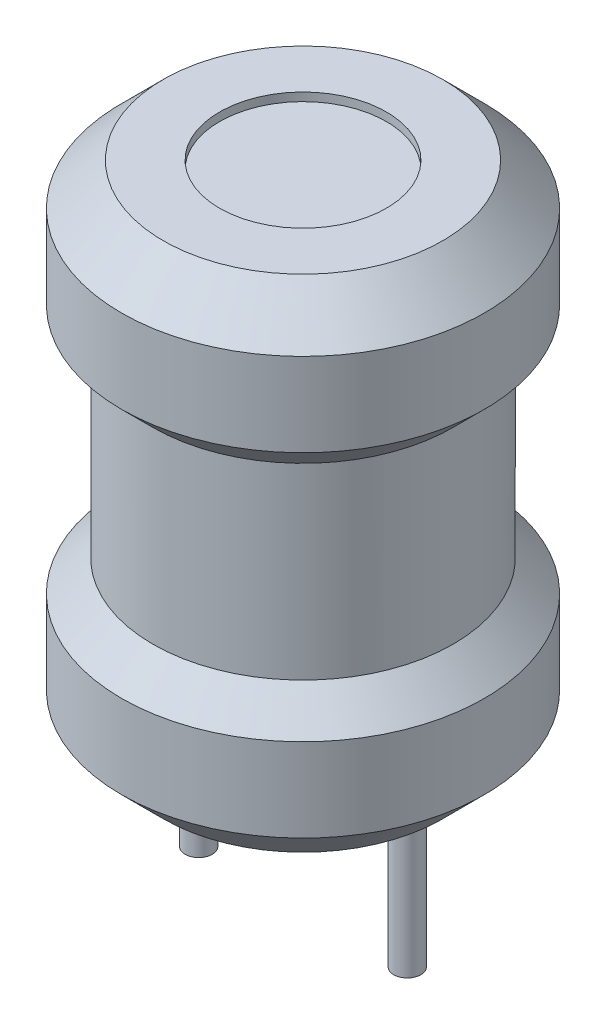
ISO-10303-21;
HEADER;
FILE_DESCRIPTION(('STEP AP214'),'2;1');
FILE_NAME('part.step','',(''),(''),'','','');
FILE_SCHEMA(('AUTOMOTIVE_DESIGN { 1 0 10303 214 1 1 1 1 }'));
ENDSEC;
DATA;
#1=APPLICATION_CONTEXT('core data for automotive mechanical design processes');
#2=APPLICATION_PROTOCOL_DEFINITION('international standard','automotive_design',2000,#1);
#3=PRODUCT_CONTEXT('',#1,'mechanical');
#4=PRODUCT('Part','Part','',(#3));
#5=PRODUCT_RELATED_PRODUCT_CATEGORY('part','',(#4));
#6=PRODUCT_DEFINITION_FORMATION('','',#4);
#7=PRODUCT_DEFINITION_CONTEXT('part definition',#1,'design');
#8=PRODUCT_DEFINITION('design','',#6,#7);
#9=PRODUCT_DEFINITION_SHAPE('','',#8);
#10=(LENGTH_UNIT() NAMED_UNIT(*) SI_UNIT(.MILLI.,.METRE.));
#11=(NAMED_UNIT(*) PLANE_ANGLE_UNIT() SI_UNIT($,.RADIAN.));
#12=(NAMED_UNIT(*) SI_UNIT($,.STERADIAN.) SOLID_ANGLE_UNIT());
#13=UNCERTAINTY_MEASURE_WITH_UNIT(LENGTH_MEASURE(1.E-05),#10,'distance_accuracy_value','');
#14=(GEOMETRIC_REPRESENTATION_CONTEXT(3) GLOBAL_UNCERTAINTY_ASSIGNED_CONTEXT((#13)) GLOBAL_UNIT_ASSIGNED_CONTEXT((#10,
#11,#12)) REPRESENTATION_CONTEXT('',''));
#15=CARTESIAN_POINT('',(0.,0.,0.));
#16=DIRECTION('',(0.,0.,1.));
#17=DIRECTION('',(1.,0.,0.));
#18=AXIS2_PLACEMENT_3D('',#15,#16,#17);
#19=CARTESIAN_POINT('',(-2.5,-3.5,0.));
#20=DIRECTION('',(0.,-1.,0.));
#21=DIRECTION('',(0.,0.,-1.));
#22=AXIS2_PLACEMENT_3D('',#19,#20,#21);
#23=PLANE('',#22);
#24=CARTESIAN_POINT('',(-2.5,-3.5,0.));
#25=DIRECTION('',(0.,1.,0.));
#26=DIRECTION('',(0.,0.,1.));
#27=AXIS2_PLACEMENT_3D('',#24,#25,#26);
#28=CIRCLE('',#27,0.325);
#29=CARTESIAN_POINT('',(-2.5,-3.5,0.325));
#30=VERTEX_POINT('',#29);
#31=EDGE_CURVE('E18',#30,#30,#28,.T.);
#32=ORIENTED_EDGE('',*,*,#31,.F.);
#33=EDGE_LOOP('',(#32));
#34=FACE_BOUND('',#33,.T.);
#35=ADVANCED_FACE('F15',(#34),#23,.T.);
#36=CARTESIAN_POINT('',(2.5,-3.5,0.));
#37=DIRECTION('',(0.,-1.,0.));
#38=DIRECTION('',(0.,0.,-1.));
#39=AXIS2_PLACEMENT_3D('',#36,#37,#38);
#40=PLANE('',#39);
#41=CARTESIAN_POINT('',(2.5,-3.5,0.));
#42=DIRECTION('',(0.,1.,0.));
#43=DIRECTION('',(0.,0.,1.));
#44=AXIS2_PLACEMENT_3D('',#41,#42,#43);
#45=CIRCLE('',#44,0.325);
#46=CARTESIAN_POINT('',(2.5,-3.5,0.325));
#47=VERTEX_POINT('',#46);
#48=EDGE_CURVE('E58',#47,#47,#45,.T.);
#49=ORIENTED_EDGE('',*,*,#48,.F.);
#50=EDGE_LOOP('',(#49));
#51=FACE_BOUND('',#50,.T.);
#52=ADVANCED_FACE('F69',(#51),#40,.T.);
#53=CARTESIAN_POINT('',(0.,11.8,0.));
#54=DIRECTION('',(0.,1.,0.));
#55=DIRECTION('',(0.,0.,1.));
#56=AXIS2_PLACEMENT_3D('',#53,#54,#55);
#57=PLANE('',#56);
#58=CARTESIAN_POINT('',(0.,11.8,0.));
#59=DIRECTION('',(0.,1.,0.));
#60=DIRECTION('',(0.,0.,1.));
#61=AXIS2_PLACEMENT_3D('',#58,#59,#60);
#62=CIRCLE('',#61,2.);
#63=CARTESIAN_POINT('',(0.,11.8,2.));
#64=VERTEX_POINT('',#63);
#65=EDGE_CURVE('E56',#64,#64,#62,.T.);
#66=ORIENTED_EDGE('',*,*,#65,.T.);
#67=EDGE_LOOP('',(#66));
#68=FACE_BOUND('',#67,.T.);
#69=ADVANCED_FACE('F74',(#68),#57,.T.);
#70=CARTESIAN_POINT('',(-2.5,-3.5,0.));
#71=DIRECTION('',(0.,1.,0.));
#72=DIRECTION('',(0.,0.,1.));
#73=AXIS2_PLACEMENT_3D('',#70,#71,#72);
#74=CYLINDRICAL_SURFACE('',#73,0.325);
#75=ORIENTED_EDGE('',*,*,#31,.T.);
#76=EDGE_LOOP('',(#75));
#77=FACE_BOUND('',#76,.T.);
#78=CARTESIAN_POINT('',(-2.5,0.,0.));
#79=DIRECTION('',(0.,1.,0.));
#80=DIRECTION('',(0.,0.,1.));
#81=AXIS2_PLACEMENT_3D('',#78,#79,#80);
#82=CIRCLE('',#81,0.325);
#83=CARTESIAN_POINT('',(-2.5,0.,0.325));
#84=VERTEX_POINT('',#83);
#85=EDGE_CURVE('E53',#84,#84,#82,.F.);
#86=ORIENTED_EDGE('',*,*,#85,.T.);
#87=EDGE_LOOP('',(#86));
#88=FACE_BOUND('',#87,.T.);
#89=ADVANCED_FACE('F65',(#77,#88),#74,.T.);
#90=CARTESIAN_POINT('',(2.5,-3.5,0.));
#91=DIRECTION('',(0.,1.,0.));
#92=DIRECTION('',(0.,0.,1.));
#93=AXIS2_PLACEMENT_3D('',#90,#91,#92);
#94=CYLINDRICAL_SURFACE('',#93,0.325);
#95=ORIENTED_EDGE('',*,*,#48,.T.);
#96=EDGE_LOOP('',(#95));
#97=FACE_BOUND('',#96,.T.);
#98=CARTESIAN_POINT('',(2.5,0.,0.));
#99=DIRECTION('',(0.,1.,0.));
#100=DIRECTION('',(0.,0.,1.));
#101=AXIS2_PLACEMENT_3D('',#98,#99,#100);
#102=CIRCLE('',#101,0.325);
#103=CARTESIAN_POINT('',(2.5,0.,0.325));
#104=VERTEX_POINT('',#103);
#105=EDGE_CURVE('E50',#104,#104,#102,.F.);
#106=ORIENTED_EDGE('',*,*,#105,.T.);
#107=EDGE_LOOP('',(#106));
#108=FACE_BOUND('',#107,.T.);
#109=ADVANCED_FACE('F118',(#97,#108),#94,.T.);
#110=CARTESIAN_POINT('',(0.,11.8,0.));
#111=DIRECTION('',(0.,1.,0.));
#112=DIRECTION('',(0.,0.,1.));
#113=AXIS2_PLACEMENT_3D('',#110,#111,#112);
#114=CYLINDRICAL_SURFACE('',#113,2.);
#115=CARTESIAN_POINT('',(0.,12.,0.));
#116=DIRECTION('',(0.,1.,0.));
#117=DIRECTION('',(0.,0.,1.));
#118=AXIS2_PLACEMENT_3D('',#115,#116,#117);
#119=CIRCLE('',#118,2.);
#120=CARTESIAN_POINT('',(0.,12.,2.));
#121=VERTEX_POINT('',#120);
#122=EDGE_CURVE('E47',#121,#121,#119,.F.);
#123=ORIENTED_EDGE('',*,*,#122,.F.);
#124=EDGE_LOOP('',(#123));
#125=FACE_BOUND('',#124,.T.);
#126=ORIENTED_EDGE('',*,*,#65,.F.);
#127=EDGE_LOOP('',(#126));
#128=FACE_BOUND('',#127,.T.);
#129=ADVANCED_FACE('F114',(#125,#128),#114,.F.);
#130=CARTESIAN_POINT('',(0.,0.,0.));
#131=DIRECTION('',(0.,1.,0.));
#132=DIRECTION('',(0.,0.,1.));
#133=AXIS2_PLACEMENT_3D('',#130,#131,#132);
#134=PLANE('',#133);
#135=ORIENTED_EDGE('',*,*,#105,.F.);
#136=EDGE_LOOP('',(#135));
#137=FACE_BOUND('',#136,.T.);
#138=CARTESIAN_POINT('',(0.,-5.6843418860808E-11,0.));
#139=DIRECTION('',(0.,1.,0.));
#140=DIRECTION('',(0.,0.,1.));
#141=AXIS2_PLACEMENT_3D('',#138,#139,#140);
#142=CIRCLE('',#141,3.35000000001173);
#143=CARTESIAN_POINT('',(0.,-5.6843418860808E-11,3.35000000001173));
#144=VERTEX_POINT('',#143);
#145=EDGE_CURVE('E44',#144,#144,#142,.T.);
#146=ORIENTED_EDGE('',*,*,#145,.F.);
#147=EDGE_LOOP('',(#146));
#148=FACE_BOUND('',#147,.T.);
#149=ORIENTED_EDGE('',*,*,#85,.F.);
#150=EDGE_LOOP('',(#149));
#151=FACE_BOUND('',#150,.T.);
#152=ADVANCED_FACE('F110',(#137,#148,#151),#134,.F.);
#153=CARTESIAN_POINT('',(0.,12.,0.));
#154=DIRECTION('',(0.,1.,0.));
#155=DIRECTION('',(0.,0.,1.));
#156=AXIS2_PLACEMENT_3D('',#153,#154,#155);
#157=PLANE('',#156);
#158=ORIENTED_EDGE('',*,*,#122,.T.);
#159=EDGE_LOOP('',(#158));
#160=FACE_BOUND('',#159,.T.);
#161=CARTESIAN_POINT('',(0.,12.0000000000005,0.));
#162=DIRECTION('',(0.,-1.,0.));
#163=DIRECTION('',(0.,0.,-1.));
#164=AXIS2_PLACEMENT_3D('',#161,#162,#163);
#165=CIRCLE('',#164,3.35000000001173);
#166=CARTESIAN_POINT('',(0.,12.0000000000005,-3.35000000001173));
#167=VERTEX_POINT('',#166);
#168=EDGE_CURVE('E41',#167,#167,#165,.T.);
#169=ORIENTED_EDGE('',*,*,#168,.F.);
#170=EDGE_LOOP('',(#169));
#171=FACE_BOUND('',#170,.T.);
#172=ADVANCED_FACE('F106',(#160,#171),#157,.T.);
#173=CARTESIAN_POINT('',(0.,1.0000000000332,0.));
#174=DIRECTION('',(0.,1.,0.));
#175=DIRECTION('',(0.,0.,1.));
#176=AXIS2_PLACEMENT_3D('',#173,#174,#175);
#177=CONICAL_SURFACE('',#176,4.35000000010177,0.785398163397448);
#178=CARTESIAN_POINT('',(0.,1.,0.));
#179=DIRECTION('',(0.,-1.,0.));
#180=DIRECTION('',(0.,0.,-1.));
#181=AXIS2_PLACEMENT_3D('',#178,#179,#180);
#182=CIRCLE('',#181,4.35);
#183=CARTESIAN_POINT('',(0.,1.,-4.35));
#184=VERTEX_POINT('',#183);
#185=EDGE_CURVE('E38',#184,#184,#182,.F.);
#186=ORIENTED_EDGE('',*,*,#185,.F.);
#187=EDGE_LOOP('',(#186));
#188=FACE_BOUND('',#187,.T.);
#189=ORIENTED_EDGE('',*,*,#145,.T.);
#190=EDGE_LOOP('',(#189));
#191=FACE_BOUND('',#190,.T.);
#192=ADVANCED_FACE('F102',(#188,#191),#177,.T.);
#193=CARTESIAN_POINT('',(0.,10.9999999999673,0.));
#194=DIRECTION('',(0.,-1.,0.));
#195=DIRECTION('',(0.,0.,-1.));
#196=AXIS2_PLACEMENT_3D('',#193,#194,#195);
#197=CONICAL_SURFACE('',#196,4.34999999998809,0.785398163369027);
#198=CARTESIAN_POINT('',(0.,11.,0.));
#199=DIRECTION('',(0.,-1.,0.));
#200=DIRECTION('',(0.,0.,-1.));
#201=AXIS2_PLACEMENT_3D('',#198,#199,#200);
#202=CIRCLE('',#201,4.35);
#203=CARTESIAN_POINT('',(0.,11.,-4.35));
#204=VERTEX_POINT('',#203);
#205=EDGE_CURVE('E35',#204,#204,#202,.T.);
#206=ORIENTED_EDGE('',*,*,#205,.F.);
#207=EDGE_LOOP('',(#206));
#208=FACE_BOUND('',#207,.T.);
#209=ORIENTED_EDGE('',*,*,#168,.T.);
#210=EDGE_LOOP('',(#209));
#211=FACE_BOUND('',#210,.T.);
#212=ADVANCED_FACE('F98',(#208,#211),#197,.T.);
#213=CARTESIAN_POINT('',(0.,12.,0.));
#214=DIRECTION('',(0.,-1.,0.));
#215=DIRECTION('',(0.,0.,-1.));
#216=AXIS2_PLACEMENT_3D('',#213,#214,#215);
#217=CYLINDRICAL_SURFACE('',#216,4.35);
#218=ORIENTED_EDGE('',*,*,#185,.T.);
#219=EDGE_LOOP('',(#218));
#220=FACE_BOUND('',#219,.T.);
#221=CARTESIAN_POINT('',(0.,3.00000000004275,0.));
#222=DIRECTION('',(0.,-1.,0.));
#223=DIRECTION('',(0.,0.,-1.));
#224=AXIS2_PLACEMENT_3D('',#221,#222,#223);
#225=CIRCLE('',#224,4.34999999998809);
#226=CARTESIAN_POINT('',(0.,3.00000000004275,-4.34999999998809));
#227=VERTEX_POINT('',#226);
#228=EDGE_CURVE('E32',#227,#227,#225,.F.);
#229=ORIENTED_EDGE('',*,*,#228,.F.);
#230=EDGE_LOOP('',(#229));
#231=FACE_BOUND('',#230,.T.);
#232=ADVANCED_FACE('F94',(#220,#231),#217,.T.);
#233=CARTESIAN_POINT('',(0.,12.,0.));
#234=DIRECTION('',(0.,-1.,0.));
#235=DIRECTION('',(0.,0.,-1.));
#236=AXIS2_PLACEMENT_3D('',#233,#234,#235);
#237=CYLINDRICAL_SURFACE('',#236,4.35);
#238=CARTESIAN_POINT('',(0.,9.0000000000714,0.));
#239=DIRECTION('',(0.,1.,0.));
#240=DIRECTION('',(0.,0.,1.));
#241=AXIS2_PLACEMENT_3D('',#238,#239,#240);
#242=CIRCLE('',#241,4.34999999998809);
#243=CARTESIAN_POINT('',(0.,9.0000000000714,4.34999999998809));
#244=VERTEX_POINT('',#243);
#245=EDGE_CURVE('E27',#244,#244,#242,.F.);
#246=ORIENTED_EDGE('',*,*,#245,.F.);
#247=EDGE_LOOP('',(#246));
#248=FACE_BOUND('',#247,.T.);
#249=ORIENTED_EDGE('',*,*,#205,.T.);
#250=EDGE_LOOP('',(#249));
#251=FACE_BOUND('',#250,.T.);
#252=ADVANCED_FACE('F90',(#248,#251),#237,.T.);
#253=CARTESIAN_POINT('',(0.,3.00000000009959,0.));
#254=DIRECTION('',(0.,-1.,0.));
#255=DIRECTION('',(0.,0.,-1.));
#256=AXIS2_PLACEMENT_3D('',#253,#254,#255);
#257=CONICAL_SURFACE('',#256,4.3499999998744,0.785398163359553);
#258=ORIENTED_EDGE('',*,*,#228,.T.);
#259=EDGE_LOOP('',(#258));
#260=FACE_BOUND('',#259,.T.);
#261=CARTESIAN_POINT('',(0.,3.75,0.));
#262=DIRECTION('',(0.,1.,0.));
#263=DIRECTION('',(0.,0.,1.));
#264=AXIS2_PLACEMENT_3D('',#261,#262,#263);
#265=CIRCLE('',#264,3.6);
#266=CARTESIAN_POINT('',(0.,3.75,3.6));
#267=VERTEX_POINT('',#266);
#268=EDGE_CURVE('E22',#267,#267,#265,.T.);
#269=ORIENTED_EDGE('',*,*,#268,.F.);
#270=EDGE_LOOP('',(#269));
#271=FACE_BOUND('',#270,.T.);
#272=ADVANCED_FACE('F83',(#260,#271),#257,.T.);
#273=CARTESIAN_POINT('',(0.,9.0000000000714,0.));
#274=DIRECTION('',(0.,1.,0.));
#275=DIRECTION('',(0.,0.,1.));
#276=AXIS2_PLACEMENT_3D('',#273,#274,#275);
#277=CONICAL_SURFACE('',#276,4.34999999998809,0.785398163359553);
#278=ORIENTED_EDGE('',*,*,#245,.T.);
#279=EDGE_LOOP('',(#278));
#280=FACE_BOUND('',#279,.T.);
#281=CARTESIAN_POINT('',(0.,8.25000000000001,0.));
#282=DIRECTION('',(0.,1.,0.));
#283=DIRECTION('',(0.,0.,1.));
#284=AXIS2_PLACEMENT_3D('',#281,#282,#283);
#285=CIRCLE('',#284,3.6);
#286=CARTESIAN_POINT('',(0.,8.25000000000001,3.6));
#287=VERTEX_POINT('',#286);
#288=EDGE_CURVE('E10',#287,#287,#285,.F.);
#289=ORIENTED_EDGE('',*,*,#288,.F.);
#290=EDGE_LOOP('',(#289));
#291=FACE_BOUND('',#290,.T.);
#292=ADVANCED_FACE('F78',(#280,#291),#277,.T.);
#293=CARTESIAN_POINT('',(0.,12.,0.));
#294=DIRECTION('',(0.,1.,0.));
#295=DIRECTION('',(0.,0.,1.));
#296=AXIS2_PLACEMENT_3D('',#293,#294,#295);
#297=CYLINDRICAL_SURFACE('',#296,3.6);
#298=ORIENTED_EDGE('',*,*,#288,.T.);
#299=EDGE_LOOP('',(#298));
#300=FACE_BOUND('',#299,.T.);
#301=ORIENTED_EDGE('',*,*,#268,.T.);
#302=EDGE_LOOP('',(#301));
#303=FACE_BOUND('',#302,.T.);
#304=ADVANCED_FACE('F76',(#300,#303),#297,.T.);
#305=CLOSED_SHELL('',(#35,#52,#69,#89,#109,#129,#152,#172,#192,#212,#232,#252,#272,#292,#304));
#306=MANIFOLD_SOLID_BREP('B1',#305);
#307=ADVANCED_BREP_SHAPE_REPRESENTATION('',(#18,#306),#14);
#308=SHAPE_DEFINITION_REPRESENTATION(#9,#307);
ENDSEC;
END-ISO-10303-21;
